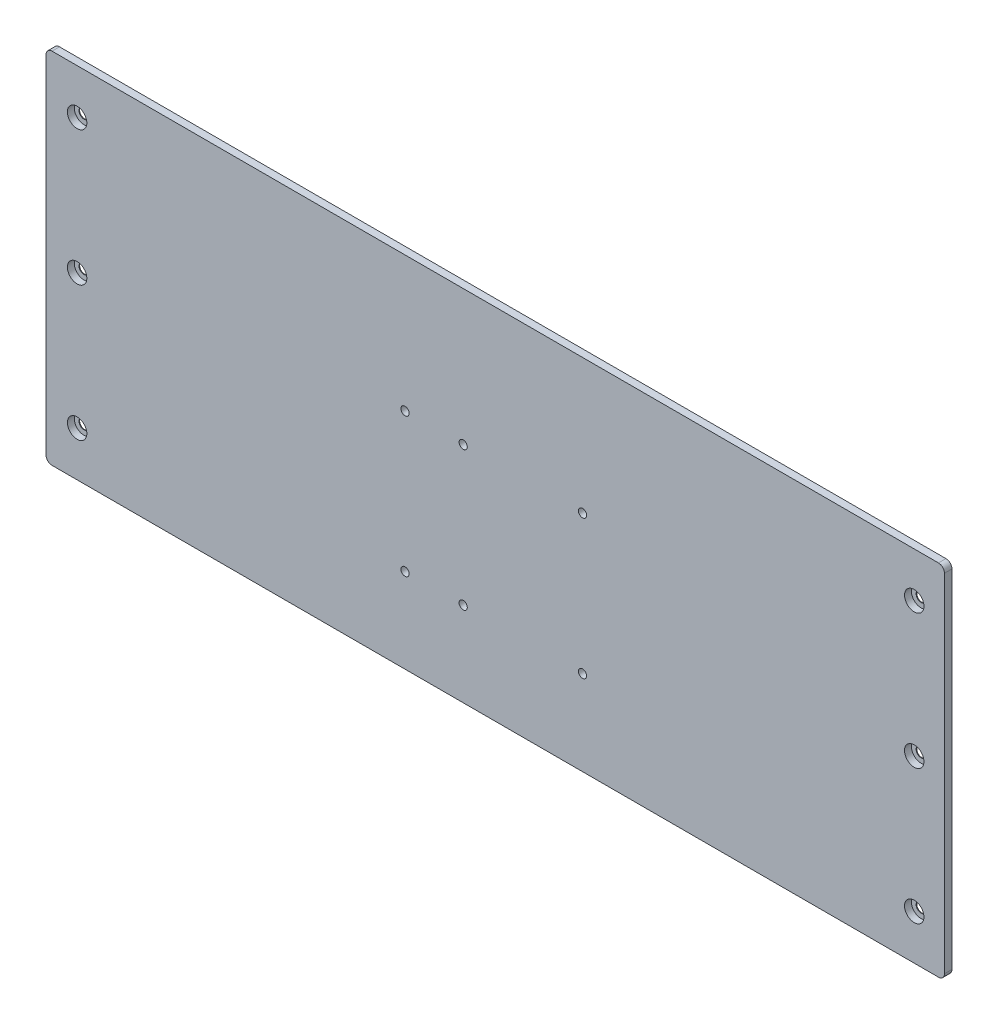
ISO-10303-21;
HEADER;
FILE_DESCRIPTION(('STEP AP214'),'2;1');
FILE_NAME('part.step','',(''),(''),'','','');
FILE_SCHEMA(('AUTOMOTIVE_DESIGN { 1 0 10303 214 1 1 1 1 }'));
ENDSEC;
DATA;
#1=APPLICATION_CONTEXT('core data for automotive mechanical design processes');
#2=APPLICATION_PROTOCOL_DEFINITION('international standard','automotive_design',2000,#1);
#3=PRODUCT_CONTEXT('',#1,'mechanical');
#4=PRODUCT('Part','Part','',(#3));
#5=PRODUCT_RELATED_PRODUCT_CATEGORY('part','',(#4));
#6=PRODUCT_DEFINITION_FORMATION('','',#4);
#7=PRODUCT_DEFINITION_CONTEXT('part definition',#1,'design');
#8=PRODUCT_DEFINITION('design','',#6,#7);
#9=PRODUCT_DEFINITION_SHAPE('','',#8);
#10=(LENGTH_UNIT() NAMED_UNIT(*) SI_UNIT(.MILLI.,.METRE.));
#11=(NAMED_UNIT(*) PLANE_ANGLE_UNIT() SI_UNIT($,.RADIAN.));
#12=(NAMED_UNIT(*) SI_UNIT($,.STERADIAN.) SOLID_ANGLE_UNIT());
#13=UNCERTAINTY_MEASURE_WITH_UNIT(LENGTH_MEASURE(1.E-05),#10,'distance_accuracy_value','');
#14=(GEOMETRIC_REPRESENTATION_CONTEXT(3) GLOBAL_UNCERTAINTY_ASSIGNED_CONTEXT((#13)) GLOBAL_UNIT_ASSIGNED_CONTEXT((#10,
#11,#12)) REPRESENTATION_CONTEXT('',''));
#15=CARTESIAN_POINT('',(0.,0.,0.));
#16=DIRECTION('',(0.,0.,1.));
#17=DIRECTION('',(1.,0.,0.));
#18=AXIS2_PLACEMENT_3D('',#15,#16,#17);
#19=CARTESIAN_POINT('',(-296.5,-116.,5.));
#20=DIRECTION('',(0.,0.,-1.));
#21=DIRECTION('',(-1.,0.,0.));
#22=AXIS2_PLACEMENT_3D('',#19,#20,#21);
#23=CYLINDRICAL_SURFACE('',#22,4.);
#24=CARTESIAN_POINT('',(-296.5,-116.,0.));
#25=DIRECTION('',(0.,0.,1.));
#26=DIRECTION('',(-1.,0.,0.));
#27=AXIS2_PLACEMENT_3D('',#24,#25,#26);
#28=CIRCLE('',#27,4.);
#29=CARTESIAN_POINT('',(-300.5,-116.,0.));
#30=VERTEX_POINT('',#29);
#31=CARTESIAN_POINT('',(-296.5,-120.,0.));
#32=VERTEX_POINT('',#31);
#33=EDGE_CURVE('E129',#30,#32,#28,.T.);
#34=ORIENTED_EDGE('',*,*,#33,.T.);
#35=DIRECTION('',(0.,0.,-1.));
#36=VECTOR('',#35,1.);
#37=CARTESIAN_POINT('',(-296.5,-120.,5.));
#38=LINE('',#37,#36);
#39=CARTESIAN_POINT('',(-296.5,-120.,5.));
#40=VERTEX_POINT('',#39);
#41=EDGE_CURVE('E11',#40,#32,#38,.T.);
#42=ORIENTED_EDGE('',*,*,#41,.F.);
#43=CARTESIAN_POINT('',(-296.5,-116.,5.));
#44=DIRECTION('',(0.,0.,1.));
#45=DIRECTION('',(-1.,0.,0.));
#46=AXIS2_PLACEMENT_3D('',#43,#44,#45);
#47=CIRCLE('',#46,4.);
#48=CARTESIAN_POINT('',(-300.5,-116.,5.));
#49=VERTEX_POINT('',#48);
#50=EDGE_CURVE('E144',#49,#40,#47,.T.);
#51=ORIENTED_EDGE('',*,*,#50,.F.);
#52=DIRECTION('',(0.,0.,-1.));
#53=VECTOR('',#52,1.);
#54=CARTESIAN_POINT('',(-300.5,-116.,5.));
#55=LINE('',#54,#53);
#56=EDGE_CURVE('E125',#49,#30,#55,.T.);
#57=ORIENTED_EDGE('',*,*,#56,.T.);
#58=EDGE_LOOP('',(#34,#42,#51,#57));
#59=FACE_BOUND('',#58,.T.);
#60=ADVANCED_FACE('F33',(#59),#23,.T.);
#61=CARTESIAN_POINT('',(-296.5,-120.,5.));
#62=DIRECTION('',(0.,1.,0.));
#63=DIRECTION('',(0.,0.,1.));
#64=AXIS2_PLACEMENT_3D('',#61,#62,#63);
#65=PLANE('',#64);
#66=DIRECTION('',(1.,0.,0.));
#67=VECTOR('',#66,1.);
#68=CARTESIAN_POINT('',(-296.5,-120.,0.));
#69=LINE('',#68,#67);
#70=CARTESIAN_POINT('',(296.5,-120.,0.));
#71=VERTEX_POINT('',#70);
#72=EDGE_CURVE('E132',#32,#71,#69,.T.);
#73=ORIENTED_EDGE('',*,*,#72,.T.);
#74=DIRECTION('',(0.,0.,-1.));
#75=VECTOR('',#74,1.);
#76=CARTESIAN_POINT('',(296.5,-120.,5.));
#77=LINE('',#76,#75);
#78=CARTESIAN_POINT('',(296.5,-120.,5.));
#79=VERTEX_POINT('',#78);
#80=EDGE_CURVE('E41',#79,#71,#77,.T.);
#81=ORIENTED_EDGE('',*,*,#80,.F.);
#82=DIRECTION('',(1.,0.,0.));
#83=VECTOR('',#82,1.);
#84=CARTESIAN_POINT('',(-296.5,-120.,5.));
#85=LINE('',#84,#83);
#86=EDGE_CURVE('E92',#40,#79,#85,.T.);
#87=ORIENTED_EDGE('',*,*,#86,.F.);
#88=ORIENTED_EDGE('',*,*,#41,.T.);
#89=EDGE_LOOP('',(#73,#81,#87,#88));
#90=FACE_BOUND('',#89,.T.);
#91=ADVANCED_FACE('F356',(#90),#65,.F.);
#92=CARTESIAN_POINT('',(296.5,-116.,5.));
#93=DIRECTION('',(0.,0.,-1.));
#94=DIRECTION('',(-1.,0.,0.));
#95=AXIS2_PLACEMENT_3D('',#92,#93,#94);
#96=CYLINDRICAL_SURFACE('',#95,4.);
#97=CARTESIAN_POINT('',(296.5,-116.,0.));
#98=DIRECTION('',(0.,0.,1.));
#99=DIRECTION('',(1.,0.,0.));
#100=AXIS2_PLACEMENT_3D('',#97,#98,#99);
#101=CIRCLE('',#100,4.);
#102=CARTESIAN_POINT('',(300.5,-116.,0.));
#103=VERTEX_POINT('',#102);
#104=EDGE_CURVE('E135',#71,#103,#101,.T.);
#105=ORIENTED_EDGE('',*,*,#104,.T.);
#106=DIRECTION('',(0.,0.,-1.));
#107=VECTOR('',#106,1.);
#108=CARTESIAN_POINT('',(300.5,-116.,5.));
#109=LINE('',#108,#107);
#110=CARTESIAN_POINT('',(300.5,-116.,5.));
#111=VERTEX_POINT('',#110);
#112=EDGE_CURVE('E151',#111,#103,#109,.T.);
#113=ORIENTED_EDGE('',*,*,#112,.F.);
#114=CARTESIAN_POINT('',(296.5,-116.,5.));
#115=DIRECTION('',(0.,0.,1.));
#116=DIRECTION('',(1.,0.,0.));
#117=AXIS2_PLACEMENT_3D('',#114,#115,#116);
#118=CIRCLE('',#117,4.);
#119=EDGE_CURVE('E159',#79,#111,#118,.T.);
#120=ORIENTED_EDGE('',*,*,#119,.F.);
#121=ORIENTED_EDGE('',*,*,#80,.T.);
#122=EDGE_LOOP('',(#105,#113,#120,#121));
#123=FACE_BOUND('',#122,.T.);
#124=ADVANCED_FACE('F157',(#123),#96,.T.);
#125=CARTESIAN_POINT('',(300.5,-116.,5.));
#126=DIRECTION('',(-1.,0.,0.));
#127=DIRECTION('',(0.,0.,1.));
#128=AXIS2_PLACEMENT_3D('',#125,#126,#127);
#129=PLANE('',#128);
#130=DIRECTION('',(0.,1.,0.));
#131=VECTOR('',#130,1.);
#132=CARTESIAN_POINT('',(300.5,-116.,0.));
#133=LINE('',#132,#131);
#134=CARTESIAN_POINT('',(300.5,116.,0.));
#135=VERTEX_POINT('',#134);
#136=EDGE_CURVE('E137',#103,#135,#133,.T.);
#137=ORIENTED_EDGE('',*,*,#136,.T.);
#138=DIRECTION('',(0.,0.,-1.));
#139=VECTOR('',#138,1.);
#140=CARTESIAN_POINT('',(300.5,116.,5.));
#141=LINE('',#140,#139);
#142=CARTESIAN_POINT('',(300.5,116.,5.));
#143=VERTEX_POINT('',#142);
#144=EDGE_CURVE('E148',#143,#135,#141,.T.);
#145=ORIENTED_EDGE('',*,*,#144,.F.);
#146=DIRECTION('',(0.,1.,0.));
#147=VECTOR('',#146,1.);
#148=CARTESIAN_POINT('',(300.5,-116.,5.));
#149=LINE('',#148,#147);
#150=EDGE_CURVE('E171',#111,#143,#149,.T.);
#151=ORIENTED_EDGE('',*,*,#150,.F.);
#152=ORIENTED_EDGE('',*,*,#112,.T.);
#153=EDGE_LOOP('',(#137,#145,#151,#152));
#154=FACE_BOUND('',#153,.T.);
#155=ADVANCED_FACE('F167',(#154),#129,.F.);
#156=CARTESIAN_POINT('',(296.5,116.,5.));
#157=DIRECTION('',(0.,0.,-1.));
#158=DIRECTION('',(-1.,0.,0.));
#159=AXIS2_PLACEMENT_3D('',#156,#157,#158);
#160=CYLINDRICAL_SURFACE('',#159,4.);
#161=CARTESIAN_POINT('',(296.5,116.,0.));
#162=DIRECTION('',(0.,0.,1.));
#163=DIRECTION('',(1.,0.,0.));
#164=AXIS2_PLACEMENT_3D('',#161,#162,#163);
#165=CIRCLE('',#164,4.);
#166=CARTESIAN_POINT('',(296.5,120.,0.));
#167=VERTEX_POINT('',#166);
#168=EDGE_CURVE('E139',#135,#167,#165,.T.);
#169=ORIENTED_EDGE('',*,*,#168,.T.);
#170=DIRECTION('',(0.,0.,-1.));
#171=VECTOR('',#170,1.);
#172=CARTESIAN_POINT('',(296.5,120.,5.));
#173=LINE('',#172,#171);
#174=CARTESIAN_POINT('',(296.5,120.,5.));
#175=VERTEX_POINT('',#174);
#176=EDGE_CURVE('E120',#175,#167,#173,.T.);
#177=ORIENTED_EDGE('',*,*,#176,.F.);
#178=CARTESIAN_POINT('',(296.5,116.,5.));
#179=DIRECTION('',(0.,0.,1.));
#180=DIRECTION('',(1.,0.,0.));
#181=AXIS2_PLACEMENT_3D('',#178,#179,#180);
#182=CIRCLE('',#181,4.);
#183=EDGE_CURVE('E111',#143,#175,#182,.T.);
#184=ORIENTED_EDGE('',*,*,#183,.F.);
#185=ORIENTED_EDGE('',*,*,#144,.T.);
#186=EDGE_LOOP('',(#169,#177,#184,#185));
#187=FACE_BOUND('',#186,.T.);
#188=ADVANCED_FACE('F170',(#187),#160,.T.);
#189=CARTESIAN_POINT('',(-296.5,120.,5.));
#190=DIRECTION('',(0.,-1.,0.));
#191=DIRECTION('',(0.,0.,-1.));
#192=AXIS2_PLACEMENT_3D('',#189,#190,#191);
#193=PLANE('',#192);
#194=DIRECTION('',(-1.,0.,0.));
#195=VECTOR('',#194,1.);
#196=CARTESIAN_POINT('',(-296.5,120.,0.));
#197=LINE('',#196,#195);
#198=CARTESIAN_POINT('',(-296.5,120.,0.));
#199=VERTEX_POINT('',#198);
#200=EDGE_CURVE('E119',#167,#199,#197,.T.);
#201=ORIENTED_EDGE('',*,*,#200,.T.);
#202=DIRECTION('',(0.,0.,-1.));
#203=VECTOR('',#202,1.);
#204=CARTESIAN_POINT('',(-296.5,120.,5.));
#205=LINE('',#204,#203);
#206=CARTESIAN_POINT('',(-296.5,120.,5.));
#207=VERTEX_POINT('',#206);
#208=EDGE_CURVE('E116',#207,#199,#205,.T.);
#209=ORIENTED_EDGE('',*,*,#208,.F.);
#210=DIRECTION('',(-1.,0.,0.));
#211=VECTOR('',#210,1.);
#212=CARTESIAN_POINT('',(-296.5,120.,5.));
#213=LINE('',#212,#211);
#214=EDGE_CURVE('E105',#175,#207,#213,.T.);
#215=ORIENTED_EDGE('',*,*,#214,.F.);
#216=ORIENTED_EDGE('',*,*,#176,.T.);
#217=EDGE_LOOP('',(#201,#209,#215,#216));
#218=FACE_BOUND('',#217,.T.);
#219=ADVANCED_FACE('F117',(#218),#193,.F.);
#220=CARTESIAN_POINT('',(-296.5,116.,5.));
#221=DIRECTION('',(0.,0.,-1.));
#222=DIRECTION('',(-1.,0.,0.));
#223=AXIS2_PLACEMENT_3D('',#220,#221,#222);
#224=CYLINDRICAL_SURFACE('',#223,4.);
#225=CARTESIAN_POINT('',(-296.5,116.,0.));
#226=DIRECTION('',(0.,0.,1.));
#227=DIRECTION('',(-1.,0.,0.));
#228=AXIS2_PLACEMENT_3D('',#225,#226,#227);
#229=CIRCLE('',#228,4.);
#230=CARTESIAN_POINT('',(-300.5,116.,0.));
#231=VERTEX_POINT('',#230);
#232=EDGE_CURVE('E78',#199,#231,#229,.T.);
#233=ORIENTED_EDGE('',*,*,#232,.T.);
#234=DIRECTION('',(0.,0.,-1.));
#235=VECTOR('',#234,1.);
#236=CARTESIAN_POINT('',(-300.5,116.,5.));
#237=LINE('',#236,#235);
#238=CARTESIAN_POINT('',(-300.5,116.,5.));
#239=VERTEX_POINT('',#238);
#240=EDGE_CURVE('E121',#239,#231,#237,.T.);
#241=ORIENTED_EDGE('',*,*,#240,.F.);
#242=CARTESIAN_POINT('',(-296.5,116.,5.));
#243=DIRECTION('',(0.,0.,1.));
#244=DIRECTION('',(-1.,0.,0.));
#245=AXIS2_PLACEMENT_3D('',#242,#243,#244);
#246=CIRCLE('',#245,4.);
#247=EDGE_CURVE('E109',#207,#239,#246,.T.);
#248=ORIENTED_EDGE('',*,*,#247,.F.);
#249=ORIENTED_EDGE('',*,*,#208,.T.);
#250=EDGE_LOOP('',(#233,#241,#248,#249));
#251=FACE_BOUND('',#250,.T.);
#252=ADVANCED_FACE('F123',(#251),#224,.T.);
#253=CARTESIAN_POINT('',(-300.5,-116.,5.));
#254=DIRECTION('',(1.,0.,0.));
#255=DIRECTION('',(0.,0.,-1.));
#256=AXIS2_PLACEMENT_3D('',#253,#254,#255);
#257=PLANE('',#256);
#258=DIRECTION('',(0.,-1.,0.));
#259=VECTOR('',#258,1.);
#260=CARTESIAN_POINT('',(-300.5,-116.,0.));
#261=LINE('',#260,#259);
#262=EDGE_CURVE('E84',#231,#30,#261,.T.);
#263=ORIENTED_EDGE('',*,*,#262,.T.);
#264=ORIENTED_EDGE('',*,*,#56,.F.);
#265=DIRECTION('',(0.,-1.,0.));
#266=VECTOR('',#265,1.);
#267=CARTESIAN_POINT('',(-300.5,-116.,5.));
#268=LINE('',#267,#266);
#269=EDGE_CURVE('E49',#239,#49,#268,.T.);
#270=ORIENTED_EDGE('',*,*,#269,.F.);
#271=ORIENTED_EDGE('',*,*,#240,.T.);
#272=EDGE_LOOP('',(#263,#264,#270,#271));
#273=FACE_BOUND('',#272,.T.);
#274=ADVANCED_FACE('F314',(#273),#257,.F.);
#275=CARTESIAN_POINT('',(-296.5,-116.,5.));
#276=DIRECTION('',(0.,0.,-1.));
#277=DIRECTION('',(-1.,0.,0.));
#278=AXIS2_PLACEMENT_3D('',#275,#276,#277);
#279=PLANE('',#278);
#280=CARTESIAN_POINT('',(-21.4679540056422,29.5803096634037,5.));
#281=DIRECTION('',(0.,0.,1.));
#282=DIRECTION('',(1.,0.,0.));
#283=AXIS2_PLACEMENT_3D('',#280,#281,#282);
#284=CIRCLE('',#283,2.75);
#285=CARTESIAN_POINT('',(-18.7179540056422,29.5803096634037,5.));
#286=VERTEX_POINT('',#285);
#287=EDGE_CURVE('E296',#286,#286,#284,.T.);
#288=ORIENTED_EDGE('',*,*,#287,.F.);
#289=EDGE_LOOP('',(#288));
#290=FACE_BOUND('',#289,.T.);
#291=CARTESIAN_POINT('',(58.3681719088992,29.8249942828152,5.));
#292=DIRECTION('',(0.,0.,1.));
#293=DIRECTION('',(1.,0.,0.));
#294=AXIS2_PLACEMENT_3D('',#291,#292,#293);
#295=CIRCLE('',#294,2.75);
#296=CARTESIAN_POINT('',(61.1181719088992,29.8249942828152,5.));
#297=VERTEX_POINT('',#296);
#298=EDGE_CURVE('E290',#297,#297,#295,.T.);
#299=ORIENTED_EDGE('',*,*,#298,.F.);
#300=EDGE_LOOP('',(#299));
#301=FACE_BOUND('',#300,.T.);
#302=CARTESIAN_POINT('',(-60.3750107724614,29.5803096634037,5.));
#303=DIRECTION('',(0.,0.,1.));
#304=DIRECTION('',(1.,0.,0.));
#305=AXIS2_PLACEMENT_3D('',#302,#303,#304);
#306=CIRCLE('',#305,2.75);
#307=CARTESIAN_POINT('',(-57.6250107724614,29.5803096634037,5.));
#308=VERTEX_POINT('',#307);
#309=EDGE_CURVE('E284',#308,#308,#306,.T.);
#310=ORIENTED_EDGE('',*,*,#309,.F.);
#311=EDGE_LOOP('',(#310));
#312=FACE_BOUND('',#311,.T.);
#313=CARTESIAN_POINT('',(-60.3750107724614,-63.4196903365963,5.));
#314=DIRECTION('',(0.,0.,1.));
#315=DIRECTION('',(1.,0.,0.));
#316=AXIS2_PLACEMENT_3D('',#313,#314,#315);
#317=CIRCLE('',#316,2.75);
#318=CARTESIAN_POINT('',(-57.6250107724614,-63.4196903365963,5.));
#319=VERTEX_POINT('',#318);
#320=EDGE_CURVE('E281',#319,#319,#317,.T.);
#321=ORIENTED_EDGE('',*,*,#320,.F.);
#322=EDGE_LOOP('',(#321));
#323=FACE_BOUND('',#322,.T.);
#324=CARTESIAN_POINT('',(-21.4679540056422,-63.4196903365963,5.));
#325=DIRECTION('',(0.,0.,1.));
#326=DIRECTION('',(1.,0.,0.));
#327=AXIS2_PLACEMENT_3D('',#324,#325,#326);
#328=CIRCLE('',#327,2.75);
#329=CARTESIAN_POINT('',(-18.7179540056422,-63.4196903365963,5.));
#330=VERTEX_POINT('',#329);
#331=EDGE_CURVE('E275',#330,#330,#328,.T.);
#332=ORIENTED_EDGE('',*,*,#331,.F.);
#333=EDGE_LOOP('',(#332));
#334=FACE_BOUND('',#333,.T.);
#335=CARTESIAN_POINT('',(58.3681719088992,-63.1750057171848,5.));
#336=DIRECTION('',(0.,0.,1.));
#337=DIRECTION('',(1.,0.,0.));
#338=AXIS2_PLACEMENT_3D('',#335,#336,#337);
#339=CIRCLE('',#338,2.75);
#340=CARTESIAN_POINT('',(61.1181719088992,-63.1750057171848,5.));
#341=VERTEX_POINT('',#340);
#342=EDGE_CURVE('E269',#341,#341,#339,.T.);
#343=ORIENTED_EDGE('',*,*,#342,.F.);
#344=EDGE_LOOP('',(#343));
#345=FACE_BOUND('',#344,.T.);
#346=CARTESIAN_POINT('',(-279.726805625543,90.,5.));
#347=DIRECTION('',(0.,0.,1.));
#348=DIRECTION('',(1.,0.,0.));
#349=AXIS2_PLACEMENT_3D('',#346,#347,#348);
#350=CIRCLE('',#349,6.50000000000001);
#351=CARTESIAN_POINT('',(-273.226805625543,90.,5.));
#352=VERTEX_POINT('',#351);
#353=EDGE_CURVE('E263',#352,#352,#350,.T.);
#354=ORIENTED_EDGE('',*,*,#353,.F.);
#355=EDGE_LOOP('',(#354));
#356=FACE_BOUND('',#355,.T.);
#357=CARTESIAN_POINT('',(-279.726805625543,-90.,5.));
#358=DIRECTION('',(0.,0.,1.));
#359=DIRECTION('',(1.,0.,0.));
#360=AXIS2_PLACEMENT_3D('',#357,#358,#359);
#361=CIRCLE('',#360,6.50000000000001);
#362=CARTESIAN_POINT('',(-273.226805625543,-90.,5.));
#363=VERTEX_POINT('',#362);
#364=EDGE_CURVE('E248',#363,#363,#361,.T.);
#365=ORIENTED_EDGE('',*,*,#364,.F.);
#366=EDGE_LOOP('',(#365));
#367=FACE_BOUND('',#366,.T.);
#368=CARTESIAN_POINT('',(-279.726805625543,0.,5.));
#369=DIRECTION('',(0.,0.,1.));
#370=DIRECTION('',(1.,0.,0.));
#371=AXIS2_PLACEMENT_3D('',#368,#369,#370);
#372=CIRCLE('',#371,6.50000000000001);
#373=CARTESIAN_POINT('',(-273.226805625543,0.,5.));
#374=VERTEX_POINT('',#373);
#375=EDGE_CURVE('E233',#374,#374,#372,.T.);
#376=ORIENTED_EDGE('',*,*,#375,.F.);
#377=EDGE_LOOP('',(#376));
#378=FACE_BOUND('',#377,.T.);
#379=CARTESIAN_POINT('',(280.273194374457,0.,5.));
#380=DIRECTION('',(0.,0.,1.));
#381=DIRECTION('',(1.,0.,0.));
#382=AXIS2_PLACEMENT_3D('',#379,#380,#381);
#383=CIRCLE('',#382,6.50000000000001);
#384=CARTESIAN_POINT('',(286.773194374457,0.,5.));
#385=VERTEX_POINT('',#384);
#386=EDGE_CURVE('E218',#385,#385,#383,.T.);
#387=ORIENTED_EDGE('',*,*,#386,.F.);
#388=EDGE_LOOP('',(#387));
#389=FACE_BOUND('',#388,.T.);
#390=CARTESIAN_POINT('',(280.273194374457,90.,5.));
#391=DIRECTION('',(0.,0.,1.));
#392=DIRECTION('',(1.,0.,0.));
#393=AXIS2_PLACEMENT_3D('',#390,#391,#392);
#394=CIRCLE('',#393,6.50000000000001);
#395=CARTESIAN_POINT('',(286.773194374457,90.,5.));
#396=VERTEX_POINT('',#395);
#397=EDGE_CURVE('E203',#396,#396,#394,.T.);
#398=ORIENTED_EDGE('',*,*,#397,.F.);
#399=EDGE_LOOP('',(#398));
#400=FACE_BOUND('',#399,.T.);
#401=CARTESIAN_POINT('',(280.273194374457,-90.,5.));
#402=DIRECTION('',(0.,0.,1.));
#403=DIRECTION('',(1.,0.,0.));
#404=AXIS2_PLACEMENT_3D('',#401,#402,#403);
#405=CIRCLE('',#404,6.50000000000001);
#406=CARTESIAN_POINT('',(286.773194374457,-90.,5.));
#407=VERTEX_POINT('',#406);
#408=EDGE_CURVE('E188',#407,#407,#405,.T.);
#409=ORIENTED_EDGE('',*,*,#408,.F.);
#410=EDGE_LOOP('',(#409));
#411=FACE_BOUND('',#410,.T.);
#412=ORIENTED_EDGE('',*,*,#50,.T.);
#413=ORIENTED_EDGE('',*,*,#86,.T.);
#414=ORIENTED_EDGE('',*,*,#119,.T.);
#415=ORIENTED_EDGE('',*,*,#150,.T.);
#416=ORIENTED_EDGE('',*,*,#183,.T.);
#417=ORIENTED_EDGE('',*,*,#214,.T.);
#418=ORIENTED_EDGE('',*,*,#247,.T.);
#419=ORIENTED_EDGE('',*,*,#269,.T.);
#420=EDGE_LOOP('',(#412,#413,#414,#415,#416,#417,#418,#419));
#421=FACE_BOUND('',#420,.T.);
#422=ADVANCED_FACE('F107',(#290,#301,#312,#323,#334,#345,#356,#367,#378,#389,#400,#411,#421),
#279,.F.);
#423=CARTESIAN_POINT('',(-296.5,-116.,0.));
#424=DIRECTION('',(0.,0.,-1.));
#425=DIRECTION('',(-1.,0.,0.));
#426=AXIS2_PLACEMENT_3D('',#423,#424,#425);
#427=PLANE('',#426);
#428=CARTESIAN_POINT('',(-21.4679540056422,29.5803096634037,0.));
#429=DIRECTION('',(0.,0.,1.));
#430=DIRECTION('',(1.,0.,0.));
#431=AXIS2_PLACEMENT_3D('',#428,#429,#430);
#432=CIRCLE('',#431,2.75);
#433=CARTESIAN_POINT('',(-18.7179540056422,29.5803096634037,0.));
#434=VERTEX_POINT('',#433);
#435=EDGE_CURVE('E299',#434,#434,#432,.T.);
#436=ORIENTED_EDGE('',*,*,#435,.T.);
#437=EDGE_LOOP('',(#436));
#438=FACE_BOUND('',#437,.T.);
#439=CARTESIAN_POINT('',(58.3681719088992,29.8249942828152,0.));
#440=DIRECTION('',(0.,0.,1.));
#441=DIRECTION('',(1.,0.,0.));
#442=AXIS2_PLACEMENT_3D('',#439,#440,#441);
#443=CIRCLE('',#442,2.75);
#444=CARTESIAN_POINT('',(61.1181719088992,29.8249942828152,0.));
#445=VERTEX_POINT('',#444);
#446=EDGE_CURVE('E293',#445,#445,#443,.T.);
#447=ORIENTED_EDGE('',*,*,#446,.T.);
#448=EDGE_LOOP('',(#447));
#449=FACE_BOUND('',#448,.T.);
#450=CARTESIAN_POINT('',(-60.3750107724614,29.5803096634037,0.));
#451=DIRECTION('',(0.,0.,1.));
#452=DIRECTION('',(1.,0.,0.));
#453=AXIS2_PLACEMENT_3D('',#450,#451,#452);
#454=CIRCLE('',#453,2.75);
#455=CARTESIAN_POINT('',(-57.6250107724614,29.5803096634037,0.));
#456=VERTEX_POINT('',#455);
#457=EDGE_CURVE('E287',#456,#456,#454,.T.);
#458=ORIENTED_EDGE('',*,*,#457,.T.);
#459=EDGE_LOOP('',(#458));
#460=FACE_BOUND('',#459,.T.);
#461=CARTESIAN_POINT('',(-60.3750107724614,-63.4196903365963,0.));
#462=DIRECTION('',(0.,0.,1.));
#463=DIRECTION('',(1.,0.,0.));
#464=AXIS2_PLACEMENT_3D('',#461,#462,#463);
#465=CIRCLE('',#464,2.75);
#466=CARTESIAN_POINT('',(-57.6250107724614,-63.4196903365963,0.));
#467=VERTEX_POINT('',#466);
#468=EDGE_CURVE('E278',#467,#467,#465,.T.);
#469=ORIENTED_EDGE('',*,*,#468,.T.);
#470=EDGE_LOOP('',(#469));
#471=FACE_BOUND('',#470,.T.);
#472=CARTESIAN_POINT('',(-21.4679540056422,-63.4196903365963,0.));
#473=DIRECTION('',(0.,0.,1.));
#474=DIRECTION('',(1.,0.,0.));
#475=AXIS2_PLACEMENT_3D('',#472,#473,#474);
#476=CIRCLE('',#475,2.75);
#477=CARTESIAN_POINT('',(-18.7179540056422,-63.4196903365963,0.));
#478=VERTEX_POINT('',#477);
#479=EDGE_CURVE('E272',#478,#478,#476,.T.);
#480=ORIENTED_EDGE('',*,*,#479,.T.);
#481=EDGE_LOOP('',(#480));
#482=FACE_BOUND('',#481,.T.);
#483=CARTESIAN_POINT('',(58.3681719088992,-63.1750057171848,0.));
#484=DIRECTION('',(0.,0.,1.));
#485=DIRECTION('',(1.,0.,0.));
#486=AXIS2_PLACEMENT_3D('',#483,#484,#485);
#487=CIRCLE('',#486,2.75);
#488=CARTESIAN_POINT('',(61.1181719088992,-63.1750057171848,0.));
#489=VERTEX_POINT('',#488);
#490=EDGE_CURVE('E266',#489,#489,#487,.T.);
#491=ORIENTED_EDGE('',*,*,#490,.T.);
#492=EDGE_LOOP('',(#491));
#493=FACE_BOUND('',#492,.T.);
#494=CARTESIAN_POINT('',(-279.726805625543,90.,0.));
#495=DIRECTION('',(0.,0.,1.));
#496=DIRECTION('',(1.,0.,0.));
#497=AXIS2_PLACEMENT_3D('',#494,#495,#496);
#498=CIRCLE('',#497,3.30000000000003);
#499=CARTESIAN_POINT('',(-276.426805625543,90.,0.));
#500=VERTEX_POINT('',#499);
#501=EDGE_CURVE('E260',#500,#500,#498,.T.);
#502=ORIENTED_EDGE('',*,*,#501,.T.);
#503=EDGE_LOOP('',(#502));
#504=FACE_BOUND('',#503,.T.);
#505=CARTESIAN_POINT('',(-279.726805625543,-90.,0.));
#506=DIRECTION('',(0.,0.,1.));
#507=DIRECTION('',(1.,0.,0.));
#508=AXIS2_PLACEMENT_3D('',#505,#506,#507);
#509=CIRCLE('',#508,3.30000000000003);
#510=CARTESIAN_POINT('',(-276.426805625543,-90.,0.));
#511=VERTEX_POINT('',#510);
#512=EDGE_CURVE('E245',#511,#511,#509,.T.);
#513=ORIENTED_EDGE('',*,*,#512,.T.);
#514=EDGE_LOOP('',(#513));
#515=FACE_BOUND('',#514,.T.);
#516=CARTESIAN_POINT('',(-279.726805625543,0.,0.));
#517=DIRECTION('',(0.,0.,1.));
#518=DIRECTION('',(1.,0.,0.));
#519=AXIS2_PLACEMENT_3D('',#516,#517,#518);
#520=CIRCLE('',#519,3.30000000000003);
#521=CARTESIAN_POINT('',(-276.426805625543,0.,0.));
#522=VERTEX_POINT('',#521);
#523=EDGE_CURVE('E230',#522,#522,#520,.T.);
#524=ORIENTED_EDGE('',*,*,#523,.T.);
#525=EDGE_LOOP('',(#524));
#526=FACE_BOUND('',#525,.T.);
#527=CARTESIAN_POINT('',(280.273194374457,0.,0.));
#528=DIRECTION('',(0.,0.,1.));
#529=DIRECTION('',(1.,0.,0.));
#530=AXIS2_PLACEMENT_3D('',#527,#528,#529);
#531=CIRCLE('',#530,3.30000000000003);
#532=CARTESIAN_POINT('',(283.573194374457,0.,0.));
#533=VERTEX_POINT('',#532);
#534=EDGE_CURVE('E206',#533,#533,#531,.T.);
#535=ORIENTED_EDGE('',*,*,#534,.T.);
#536=EDGE_LOOP('',(#535));
#537=FACE_BOUND('',#536,.T.);
#538=CARTESIAN_POINT('',(280.273194374457,90.,0.));
#539=DIRECTION('',(0.,0.,1.));
#540=DIRECTION('',(1.,0.,0.));
#541=AXIS2_PLACEMENT_3D('',#538,#539,#540);
#542=CIRCLE('',#541,3.30000000000003);
#543=CARTESIAN_POINT('',(283.573194374457,90.,0.));
#544=VERTEX_POINT('',#543);
#545=EDGE_CURVE('E191',#544,#544,#542,.T.);
#546=ORIENTED_EDGE('',*,*,#545,.T.);
#547=EDGE_LOOP('',(#546));
#548=FACE_BOUND('',#547,.T.);
#549=CARTESIAN_POINT('',(280.273194374457,-90.,0.));
#550=DIRECTION('',(0.,0.,1.));
#551=DIRECTION('',(1.,0.,0.));
#552=AXIS2_PLACEMENT_3D('',#549,#550,#551);
#553=CIRCLE('',#552,3.30000000000003);
#554=CARTESIAN_POINT('',(283.573194374457,-90.,0.));
#555=VERTEX_POINT('',#554);
#556=EDGE_CURVE('E133',#555,#555,#553,.T.);
#557=ORIENTED_EDGE('',*,*,#556,.T.);
#558=EDGE_LOOP('',(#557));
#559=FACE_BOUND('',#558,.T.);
#560=ORIENTED_EDGE('',*,*,#33,.F.);
#561=ORIENTED_EDGE('',*,*,#262,.F.);
#562=ORIENTED_EDGE('',*,*,#232,.F.);
#563=ORIENTED_EDGE('',*,*,#200,.F.);
#564=ORIENTED_EDGE('',*,*,#168,.F.);
#565=ORIENTED_EDGE('',*,*,#136,.F.);
#566=ORIENTED_EDGE('',*,*,#104,.F.);
#567=ORIENTED_EDGE('',*,*,#72,.F.);
#568=EDGE_LOOP('',(#560,#561,#562,#563,#564,#565,#566,#567));
#569=FACE_BOUND('',#568,.T.);
#570=ADVANCED_FACE('F163',(#438,#449,#460,#471,#482,#493,#504,#515,#526,#537,#548,#559,#569),
#427,.T.);
#571=CARTESIAN_POINT('',(280.273194374457,-90.,5.));
#572=DIRECTION('',(0.,0.,1.));
#573=DIRECTION('',(1.,0.,0.));
#574=AXIS2_PLACEMENT_3D('',#571,#572,#573);
#575=CYLINDRICAL_SURFACE('',#574,3.30000000000003);
#576=ORIENTED_EDGE('',*,*,#556,.F.);
#577=EDGE_LOOP('',(#576));
#578=FACE_BOUND('',#577,.T.);
#579=CARTESIAN_POINT('',(280.273194374457,-90.,0.374999999999989));
#580=DIRECTION('',(0.,0.,1.));
#581=DIRECTION('',(1.,0.,0.));
#582=AXIS2_PLACEMENT_3D('',#579,#580,#581);
#583=CIRCLE('',#582,3.30000000000003);
#584=CARTESIAN_POINT('',(283.573194374457,-90.,0.374999999999989));
#585=VERTEX_POINT('',#584);
#586=EDGE_CURVE('E179',#585,#585,#583,.T.);
#587=ORIENTED_EDGE('',*,*,#586,.T.);
#588=EDGE_LOOP('',(#587));
#589=FACE_BOUND('',#588,.T.);
#590=ADVANCED_FACE('F409',(#578,#589),#575,.F.);
#591=CARTESIAN_POINT('',(280.273194374457,-90.,0.400000000000001));
#592=DIRECTION('',(0.,0.,1.));
#593=DIRECTION('',(1.,0.,0.));
#594=AXIS2_PLACEMENT_3D('',#591,#592,#593);
#595=CONICAL_SURFACE('',#594,3.32500000000002,0.785398163397153);
#596=ORIENTED_EDGE('',*,*,#586,.F.);
#597=EDGE_LOOP('',(#596));
#598=FACE_BOUND('',#597,.T.);
#599=CARTESIAN_POINT('',(280.273194374457,-90.,0.400000000000001));
#600=DIRECTION('',(0.,0.,1.));
#601=DIRECTION('',(1.,0.,0.));
#602=AXIS2_PLACEMENT_3D('',#599,#600,#601);
#603=CIRCLE('',#602,3.32500000000002);
#604=CARTESIAN_POINT('',(283.598194374457,-90.,0.400000000000001));
#605=VERTEX_POINT('',#604);
#606=EDGE_CURVE('E182',#605,#605,#603,.T.);
#607=ORIENTED_EDGE('',*,*,#606,.T.);
#608=EDGE_LOOP('',(#607));
#609=FACE_BOUND('',#608,.T.);
#610=ADVANCED_FACE('F351',(#598,#609),#595,.F.);
#611=CARTESIAN_POINT('',(283.598194374457,-90.,0.400000000000002));
#612=DIRECTION('',(0.,0.,-1.));
#613=DIRECTION('',(-1.,0.,0.));
#614=AXIS2_PLACEMENT_3D('',#611,#612,#613);
#615=PLANE('',#614);
#616=ORIENTED_EDGE('',*,*,#606,.F.);
#617=EDGE_LOOP('',(#616));
#618=FACE_BOUND('',#617,.T.);
#619=CARTESIAN_POINT('',(280.273194374457,-90.,0.400000000000004));
#620=DIRECTION('',(0.,0.,1.));
#621=DIRECTION('',(1.,0.,0.));
#622=AXIS2_PLACEMENT_3D('',#619,#620,#621);
#623=CIRCLE('',#622,6.50000000000001);
#624=CARTESIAN_POINT('',(286.773194374457,-90.,0.400000000000004));
#625=VERTEX_POINT('',#624);
#626=EDGE_CURVE('E185',#625,#625,#623,.T.);
#627=ORIENTED_EDGE('',*,*,#626,.T.);
#628=EDGE_LOOP('',(#627));
#629=FACE_BOUND('',#628,.T.);
#630=ADVANCED_FACE('F341',(#618,#629),#615,.F.);
#631=CARTESIAN_POINT('',(280.273194374457,-90.,5.));
#632=DIRECTION('',(0.,0.,1.));
#633=DIRECTION('',(1.,0.,0.));
#634=AXIS2_PLACEMENT_3D('',#631,#632,#633);
#635=CYLINDRICAL_SURFACE('',#634,6.50000000000001);
#636=ORIENTED_EDGE('',*,*,#626,.F.);
#637=EDGE_LOOP('',(#636));
#638=FACE_BOUND('',#637,.T.);
#639=ORIENTED_EDGE('',*,*,#408,.T.);
#640=EDGE_LOOP('',(#639));
#641=FACE_BOUND('',#640,.T.);
#642=ADVANCED_FACE('F338',(#638,#641),#635,.F.);
#643=CARTESIAN_POINT('',(280.273194374457,90.,5.));
#644=DIRECTION('',(0.,0.,1.));
#645=DIRECTION('',(1.,0.,0.));
#646=AXIS2_PLACEMENT_3D('',#643,#644,#645);
#647=CYLINDRICAL_SURFACE('',#646,3.30000000000003);
#648=ORIENTED_EDGE('',*,*,#545,.F.);
#649=EDGE_LOOP('',(#648));
#650=FACE_BOUND('',#649,.T.);
#651=CARTESIAN_POINT('',(280.273194374457,90.,0.374999999999989));
#652=DIRECTION('',(0.,0.,1.));
#653=DIRECTION('',(1.,0.,0.));
#654=AXIS2_PLACEMENT_3D('',#651,#652,#653);
#655=CIRCLE('',#654,3.30000000000003);
#656=CARTESIAN_POINT('',(283.573194374457,90.,0.374999999999989));
#657=VERTEX_POINT('',#656);
#658=EDGE_CURVE('E194',#657,#657,#655,.T.);
#659=ORIENTED_EDGE('',*,*,#658,.T.);
#660=EDGE_LOOP('',(#659));
#661=FACE_BOUND('',#660,.T.);
#662=ADVANCED_FACE('F340',(#650,#661),#647,.F.);
#663=CARTESIAN_POINT('',(280.273194374457,90.,0.400000000000001));
#664=DIRECTION('',(0.,0.,1.));
#665=DIRECTION('',(1.,0.,0.));
#666=AXIS2_PLACEMENT_3D('',#663,#664,#665);
#667=CONICAL_SURFACE('',#666,3.32500000000002,0.785398163397153);
#668=ORIENTED_EDGE('',*,*,#658,.F.);
#669=EDGE_LOOP('',(#668));
#670=FACE_BOUND('',#669,.T.);
#671=CARTESIAN_POINT('',(280.273194374457,90.,0.400000000000001));
#672=DIRECTION('',(0.,0.,1.));
#673=DIRECTION('',(1.,0.,0.));
#674=AXIS2_PLACEMENT_3D('',#671,#672,#673);
#675=CIRCLE('',#674,3.32500000000002);
#676=CARTESIAN_POINT('',(283.598194374457,90.,0.400000000000001));
#677=VERTEX_POINT('',#676);
#678=EDGE_CURVE('E197',#677,#677,#675,.T.);
#679=ORIENTED_EDGE('',*,*,#678,.T.);
#680=EDGE_LOOP('',(#679));
#681=FACE_BOUND('',#680,.T.);
#682=ADVANCED_FACE('F348',(#670,#681),#667,.F.);
#683=CARTESIAN_POINT('',(283.598194374457,90.,0.400000000000002));
#684=DIRECTION('',(0.,0.,-1.));
#685=DIRECTION('',(-1.,0.,0.));
#686=AXIS2_PLACEMENT_3D('',#683,#684,#685);
#687=PLANE('',#686);
#688=ORIENTED_EDGE('',*,*,#678,.F.);
#689=EDGE_LOOP('',(#688));
#690=FACE_BOUND('',#689,.T.);
#691=CARTESIAN_POINT('',(280.273194374457,90.,0.400000000000004));
#692=DIRECTION('',(0.,0.,1.));
#693=DIRECTION('',(1.,0.,0.));
#694=AXIS2_PLACEMENT_3D('',#691,#692,#693);
#695=CIRCLE('',#694,6.50000000000001);
#696=CARTESIAN_POINT('',(286.773194374457,90.,0.400000000000004));
#697=VERTEX_POINT('',#696);
#698=EDGE_CURVE('E200',#697,#697,#695,.T.);
#699=ORIENTED_EDGE('',*,*,#698,.T.);
#700=EDGE_LOOP('',(#699));
#701=FACE_BOUND('',#700,.T.);
#702=ADVANCED_FACE('F450',(#690,#701),#687,.F.);
#703=CARTESIAN_POINT('',(280.273194374457,90.,5.));
#704=DIRECTION('',(0.,0.,1.));
#705=DIRECTION('',(1.,0.,0.));
#706=AXIS2_PLACEMENT_3D('',#703,#704,#705);
#707=CYLINDRICAL_SURFACE('',#706,6.50000000000001);
#708=ORIENTED_EDGE('',*,*,#698,.F.);
#709=EDGE_LOOP('',(#708));
#710=FACE_BOUND('',#709,.T.);
#711=ORIENTED_EDGE('',*,*,#397,.T.);
#712=EDGE_LOOP('',(#711));
#713=FACE_BOUND('',#712,.T.);
#714=ADVANCED_FACE('F460',(#710,#713),#707,.F.);
#715=CARTESIAN_POINT('',(280.273194374457,0.,5.));
#716=DIRECTION('',(0.,0.,1.));
#717=DIRECTION('',(1.,0.,0.));
#718=AXIS2_PLACEMENT_3D('',#715,#716,#717);
#719=CYLINDRICAL_SURFACE('',#718,3.30000000000003);
#720=ORIENTED_EDGE('',*,*,#534,.F.);
#721=EDGE_LOOP('',(#720));
#722=FACE_BOUND('',#721,.T.);
#723=CARTESIAN_POINT('',(280.273194374457,0.,0.374999999999989));
#724=DIRECTION('',(0.,0.,1.));
#725=DIRECTION('',(1.,0.,0.));
#726=AXIS2_PLACEMENT_3D('',#723,#724,#725);
#727=CIRCLE('',#726,3.30000000000003);
#728=CARTESIAN_POINT('',(283.573194374457,0.,0.374999999999989));
#729=VERTEX_POINT('',#728);
#730=EDGE_CURVE('E209',#729,#729,#727,.T.);
#731=ORIENTED_EDGE('',*,*,#730,.T.);
#732=EDGE_LOOP('',(#731));
#733=FACE_BOUND('',#732,.T.);
#734=ADVANCED_FACE('F470',(#722,#733),#719,.F.);
#735=CARTESIAN_POINT('',(280.273194374457,0.,0.400000000000001));
#736=DIRECTION('',(0.,0.,1.));
#737=DIRECTION('',(1.,0.,0.));
#738=AXIS2_PLACEMENT_3D('',#735,#736,#737);
#739=CONICAL_SURFACE('',#738,3.32500000000002,0.785398163397153);
#740=ORIENTED_EDGE('',*,*,#730,.F.);
#741=EDGE_LOOP('',(#740));
#742=FACE_BOUND('',#741,.T.);
#743=CARTESIAN_POINT('',(280.273194374457,0.,0.400000000000001));
#744=DIRECTION('',(0.,0.,1.));
#745=DIRECTION('',(1.,0.,0.));
#746=AXIS2_PLACEMENT_3D('',#743,#744,#745);
#747=CIRCLE('',#746,3.32500000000002);
#748=CARTESIAN_POINT('',(283.598194374457,0.,0.400000000000001));
#749=VERTEX_POINT('',#748);
#750=EDGE_CURVE('E212',#749,#749,#747,.T.);
#751=ORIENTED_EDGE('',*,*,#750,.T.);
#752=EDGE_LOOP('',(#751));
#753=FACE_BOUND('',#752,.T.);
#754=ADVANCED_FACE('F480',(#742,#753),#739,.F.);
#755=CARTESIAN_POINT('',(283.598194374457,0.,0.400000000000002));
#756=DIRECTION('',(0.,0.,-1.));
#757=DIRECTION('',(-1.,0.,0.));
#758=AXIS2_PLACEMENT_3D('',#755,#756,#757);
#759=PLANE('',#758);
#760=ORIENTED_EDGE('',*,*,#750,.F.);
#761=EDGE_LOOP('',(#760));
#762=FACE_BOUND('',#761,.T.);
#763=CARTESIAN_POINT('',(280.273194374457,0.,0.400000000000004));
#764=DIRECTION('',(0.,0.,1.));
#765=DIRECTION('',(1.,0.,0.));
#766=AXIS2_PLACEMENT_3D('',#763,#764,#765);
#767=CIRCLE('',#766,6.50000000000001);
#768=CARTESIAN_POINT('',(286.773194374457,0.,0.400000000000004));
#769=VERTEX_POINT('',#768);
#770=EDGE_CURVE('E215',#769,#769,#767,.T.);
#771=ORIENTED_EDGE('',*,*,#770,.T.);
#772=EDGE_LOOP('',(#771));
#773=FACE_BOUND('',#772,.T.);
#774=ADVANCED_FACE('F490',(#762,#773),#759,.F.);
#775=CARTESIAN_POINT('',(280.273194374457,0.,5.));
#776=DIRECTION('',(0.,0.,1.));
#777=DIRECTION('',(1.,0.,0.));
#778=AXIS2_PLACEMENT_3D('',#775,#776,#777);
#779=CYLINDRICAL_SURFACE('',#778,6.50000000000001);
#780=ORIENTED_EDGE('',*,*,#770,.F.);
#781=EDGE_LOOP('',(#780));
#782=FACE_BOUND('',#781,.T.);
#783=ORIENTED_EDGE('',*,*,#386,.T.);
#784=EDGE_LOOP('',(#783));
#785=FACE_BOUND('',#784,.T.);
#786=ADVANCED_FACE('F500',(#782,#785),#779,.F.);
#787=CARTESIAN_POINT('',(-279.726805625543,0.,5.));
#788=DIRECTION('',(0.,0.,1.));
#789=DIRECTION('',(1.,0.,0.));
#790=AXIS2_PLACEMENT_3D('',#787,#788,#789);
#791=CYLINDRICAL_SURFACE('',#790,3.30000000000003);
#792=ORIENTED_EDGE('',*,*,#523,.F.);
#793=EDGE_LOOP('',(#792));
#794=FACE_BOUND('',#793,.T.);
#795=CARTESIAN_POINT('',(-279.726805625543,0.,0.374999999999989));
#796=DIRECTION('',(0.,0.,1.));
#797=DIRECTION('',(1.,0.,0.));
#798=AXIS2_PLACEMENT_3D('',#795,#796,#797);
#799=CIRCLE('',#798,3.30000000000003);
#800=CARTESIAN_POINT('',(-276.426805625543,0.,0.374999999999989));
#801=VERTEX_POINT('',#800);
#802=EDGE_CURVE('E221',#801,#801,#799,.T.);
#803=ORIENTED_EDGE('',*,*,#802,.T.);
#804=EDGE_LOOP('',(#803));
#805=FACE_BOUND('',#804,.T.);
#806=ADVANCED_FACE('F510',(#794,#805),#791,.F.);
#807=CARTESIAN_POINT('',(-279.726805625543,0.,0.400000000000001));
#808=DIRECTION('',(0.,0.,1.));
#809=DIRECTION('',(1.,0.,0.));
#810=AXIS2_PLACEMENT_3D('',#807,#808,#809);
#811=CONICAL_SURFACE('',#810,3.32500000000002,0.785398163397153);
#812=ORIENTED_EDGE('',*,*,#802,.F.);
#813=EDGE_LOOP('',(#812));
#814=FACE_BOUND('',#813,.T.);
#815=CARTESIAN_POINT('',(-279.726805625543,0.,0.400000000000001));
#816=DIRECTION('',(0.,0.,1.));
#817=DIRECTION('',(1.,0.,0.));
#818=AXIS2_PLACEMENT_3D('',#815,#816,#817);
#819=CIRCLE('',#818,3.32500000000002);
#820=CARTESIAN_POINT('',(-276.401805625543,0.,0.400000000000001));
#821=VERTEX_POINT('',#820);
#822=EDGE_CURVE('E224',#821,#821,#819,.T.);
#823=ORIENTED_EDGE('',*,*,#822,.T.);
#824=EDGE_LOOP('',(#823));
#825=FACE_BOUND('',#824,.T.);
#826=ADVANCED_FACE('F520',(#814,#825),#811,.F.);
#827=CARTESIAN_POINT('',(-276.401805625543,0.,0.400000000000002));
#828=DIRECTION('',(0.,0.,-1.));
#829=DIRECTION('',(-1.,0.,0.));
#830=AXIS2_PLACEMENT_3D('',#827,#828,#829);
#831=PLANE('',#830);
#832=ORIENTED_EDGE('',*,*,#822,.F.);
#833=EDGE_LOOP('',(#832));
#834=FACE_BOUND('',#833,.T.);
#835=CARTESIAN_POINT('',(-279.726805625543,0.,0.400000000000004));
#836=DIRECTION('',(0.,0.,1.));
#837=DIRECTION('',(1.,0.,0.));
#838=AXIS2_PLACEMENT_3D('',#835,#836,#837);
#839=CIRCLE('',#838,6.50000000000001);
#840=CARTESIAN_POINT('',(-273.226805625543,0.,0.400000000000004));
#841=VERTEX_POINT('',#840);
#842=EDGE_CURVE('E227',#841,#841,#839,.T.);
#843=ORIENTED_EDGE('',*,*,#842,.T.);
#844=EDGE_LOOP('',(#843));
#845=FACE_BOUND('',#844,.T.);
#846=ADVANCED_FACE('F530',(#834,#845),#831,.F.);
#847=CARTESIAN_POINT('',(-279.726805625543,0.,5.));
#848=DIRECTION('',(0.,0.,1.));
#849=DIRECTION('',(1.,0.,0.));
#850=AXIS2_PLACEMENT_3D('',#847,#848,#849);
#851=CYLINDRICAL_SURFACE('',#850,6.50000000000001);
#852=ORIENTED_EDGE('',*,*,#842,.F.);
#853=EDGE_LOOP('',(#852));
#854=FACE_BOUND('',#853,.T.);
#855=ORIENTED_EDGE('',*,*,#375,.T.);
#856=EDGE_LOOP('',(#855));
#857=FACE_BOUND('',#856,.T.);
#858=ADVANCED_FACE('F540',(#854,#857),#851,.F.);
#859=CARTESIAN_POINT('',(-279.726805625543,-90.,5.));
#860=DIRECTION('',(0.,0.,1.));
#861=DIRECTION('',(1.,0.,0.));
#862=AXIS2_PLACEMENT_3D('',#859,#860,#861);
#863=CYLINDRICAL_SURFACE('',#862,3.30000000000003);
#864=ORIENTED_EDGE('',*,*,#512,.F.);
#865=EDGE_LOOP('',(#864));
#866=FACE_BOUND('',#865,.T.);
#867=CARTESIAN_POINT('',(-279.726805625543,-90.,0.374999999999989));
#868=DIRECTION('',(0.,0.,1.));
#869=DIRECTION('',(1.,0.,0.));
#870=AXIS2_PLACEMENT_3D('',#867,#868,#869);
#871=CIRCLE('',#870,3.30000000000003);
#872=CARTESIAN_POINT('',(-276.426805625543,-90.,0.374999999999989));
#873=VERTEX_POINT('',#872);
#874=EDGE_CURVE('E236',#873,#873,#871,.T.);
#875=ORIENTED_EDGE('',*,*,#874,.T.);
#876=EDGE_LOOP('',(#875));
#877=FACE_BOUND('',#876,.T.);
#878=ADVANCED_FACE('F550',(#866,#877),#863,.F.);
#879=CARTESIAN_POINT('',(-279.726805625543,-90.,0.400000000000001));
#880=DIRECTION('',(0.,0.,1.));
#881=DIRECTION('',(1.,0.,0.));
#882=AXIS2_PLACEMENT_3D('',#879,#880,#881);
#883=CONICAL_SURFACE('',#882,3.32500000000002,0.785398163397153);
#884=ORIENTED_EDGE('',*,*,#874,.F.);
#885=EDGE_LOOP('',(#884));
#886=FACE_BOUND('',#885,.T.);
#887=CARTESIAN_POINT('',(-279.726805625543,-90.,0.400000000000001));
#888=DIRECTION('',(0.,0.,1.));
#889=DIRECTION('',(1.,0.,0.));
#890=AXIS2_PLACEMENT_3D('',#887,#888,#889);
#891=CIRCLE('',#890,3.32500000000002);
#892=CARTESIAN_POINT('',(-276.401805625543,-90.,0.400000000000001));
#893=VERTEX_POINT('',#892);
#894=EDGE_CURVE('E239',#893,#893,#891,.T.);
#895=ORIENTED_EDGE('',*,*,#894,.T.);
#896=EDGE_LOOP('',(#895));
#897=FACE_BOUND('',#896,.T.);
#898=ADVANCED_FACE('F560',(#886,#897),#883,.F.);
#899=CARTESIAN_POINT('',(-276.401805625543,-90.,0.400000000000002));
#900=DIRECTION('',(0.,0.,-1.));
#901=DIRECTION('',(-1.,0.,0.));
#902=AXIS2_PLACEMENT_3D('',#899,#900,#901);
#903=PLANE('',#902);
#904=ORIENTED_EDGE('',*,*,#894,.F.);
#905=EDGE_LOOP('',(#904));
#906=FACE_BOUND('',#905,.T.);
#907=CARTESIAN_POINT('',(-279.726805625543,-90.,0.400000000000004));
#908=DIRECTION('',(0.,0.,1.));
#909=DIRECTION('',(1.,0.,0.));
#910=AXIS2_PLACEMENT_3D('',#907,#908,#909);
#911=CIRCLE('',#910,6.50000000000001);
#912=CARTESIAN_POINT('',(-273.226805625543,-90.,0.400000000000004));
#913=VERTEX_POINT('',#912);
#914=EDGE_CURVE('E242',#913,#913,#911,.T.);
#915=ORIENTED_EDGE('',*,*,#914,.T.);
#916=EDGE_LOOP('',(#915));
#917=FACE_BOUND('',#916,.T.);
#918=ADVANCED_FACE('F570',(#906,#917),#903,.F.);
#919=CARTESIAN_POINT('',(-279.726805625543,-90.,5.));
#920=DIRECTION('',(0.,0.,1.));
#921=DIRECTION('',(1.,0.,0.));
#922=AXIS2_PLACEMENT_3D('',#919,#920,#921);
#923=CYLINDRICAL_SURFACE('',#922,6.50000000000001);
#924=ORIENTED_EDGE('',*,*,#914,.F.);
#925=EDGE_LOOP('',(#924));
#926=FACE_BOUND('',#925,.T.);
#927=ORIENTED_EDGE('',*,*,#364,.T.);
#928=EDGE_LOOP('',(#927));
#929=FACE_BOUND('',#928,.T.);
#930=ADVANCED_FACE('F580',(#926,#929),#923,.F.);
#931=CARTESIAN_POINT('',(-279.726805625543,90.,5.));
#932=DIRECTION('',(0.,0.,1.));
#933=DIRECTION('',(1.,0.,0.));
#934=AXIS2_PLACEMENT_3D('',#931,#932,#933);
#935=CYLINDRICAL_SURFACE('',#934,3.30000000000003);
#936=ORIENTED_EDGE('',*,*,#501,.F.);
#937=EDGE_LOOP('',(#936));
#938=FACE_BOUND('',#937,.T.);
#939=CARTESIAN_POINT('',(-279.726805625543,90.,0.374999999999989));
#940=DIRECTION('',(0.,0.,1.));
#941=DIRECTION('',(1.,0.,0.));
#942=AXIS2_PLACEMENT_3D('',#939,#940,#941);
#943=CIRCLE('',#942,3.30000000000003);
#944=CARTESIAN_POINT('',(-276.426805625543,90.,0.374999999999989));
#945=VERTEX_POINT('',#944);
#946=EDGE_CURVE('E251',#945,#945,#943,.T.);
#947=ORIENTED_EDGE('',*,*,#946,.T.);
#948=EDGE_LOOP('',(#947));
#949=FACE_BOUND('',#948,.T.);
#950=ADVANCED_FACE('F590',(#938,#949),#935,.F.);
#951=CARTESIAN_POINT('',(-279.726805625543,90.,0.400000000000001));
#952=DIRECTION('',(0.,0.,1.));
#953=DIRECTION('',(1.,0.,0.));
#954=AXIS2_PLACEMENT_3D('',#951,#952,#953);
#955=CONICAL_SURFACE('',#954,3.32500000000002,0.785398163397153);
#956=ORIENTED_EDGE('',*,*,#946,.F.);
#957=EDGE_LOOP('',(#956));
#958=FACE_BOUND('',#957,.T.);
#959=CARTESIAN_POINT('',(-279.726805625543,90.,0.400000000000001));
#960=DIRECTION('',(0.,0.,1.));
#961=DIRECTION('',(1.,0.,0.));
#962=AXIS2_PLACEMENT_3D('',#959,#960,#961);
#963=CIRCLE('',#962,3.32500000000002);
#964=CARTESIAN_POINT('',(-276.401805625543,90.,0.400000000000001));
#965=VERTEX_POINT('',#964);
#966=EDGE_CURVE('E254',#965,#965,#963,.T.);
#967=ORIENTED_EDGE('',*,*,#966,.T.);
#968=EDGE_LOOP('',(#967));
#969=FACE_BOUND('',#968,.T.);
#970=ADVANCED_FACE('F600',(#958,#969),#955,.F.);
#971=CARTESIAN_POINT('',(-276.401805625543,90.,0.400000000000002));
#972=DIRECTION('',(0.,0.,-1.));
#973=DIRECTION('',(-1.,0.,0.));
#974=AXIS2_PLACEMENT_3D('',#971,#972,#973);
#975=PLANE('',#974);
#976=ORIENTED_EDGE('',*,*,#966,.F.);
#977=EDGE_LOOP('',(#976));
#978=FACE_BOUND('',#977,.T.);
#979=CARTESIAN_POINT('',(-279.726805625543,90.,0.400000000000004));
#980=DIRECTION('',(0.,0.,1.));
#981=DIRECTION('',(1.,0.,0.));
#982=AXIS2_PLACEMENT_3D('',#979,#980,#981);
#983=CIRCLE('',#982,6.50000000000001);
#984=CARTESIAN_POINT('',(-273.226805625543,90.,0.400000000000004));
#985=VERTEX_POINT('',#984);
#986=EDGE_CURVE('E257',#985,#985,#983,.T.);
#987=ORIENTED_EDGE('',*,*,#986,.T.);
#988=EDGE_LOOP('',(#987));
#989=FACE_BOUND('',#988,.T.);
#990=ADVANCED_FACE('F610',(#978,#989),#975,.F.);
#991=CARTESIAN_POINT('',(-279.726805625543,90.,5.));
#992=DIRECTION('',(0.,0.,1.));
#993=DIRECTION('',(1.,0.,0.));
#994=AXIS2_PLACEMENT_3D('',#991,#992,#993);
#995=CYLINDRICAL_SURFACE('',#994,6.50000000000001);
#996=ORIENTED_EDGE('',*,*,#986,.F.);
#997=EDGE_LOOP('',(#996));
#998=FACE_BOUND('',#997,.T.);
#999=ORIENTED_EDGE('',*,*,#353,.T.);
#1000=EDGE_LOOP('',(#999));
#1001=FACE_BOUND('',#1000,.T.);
#1002=ADVANCED_FACE('F620',(#998,#1001),#995,.F.);
#1003=CARTESIAN_POINT('',(58.3681719088992,-63.1750057171848,5.));
#1004=DIRECTION('',(0.,0.,1.));
#1005=DIRECTION('',(1.,0.,0.));
#1006=AXIS2_PLACEMENT_3D('',#1003,#1004,#1005);
#1007=CYLINDRICAL_SURFACE('',#1006,2.75);
#1008=ORIENTED_EDGE('',*,*,#490,.F.);
#1009=EDGE_LOOP('',(#1008));
#1010=FACE_BOUND('',#1009,.T.);
#1011=ORIENTED_EDGE('',*,*,#342,.T.);
#1012=EDGE_LOOP('',(#1011));
#1013=FACE_BOUND('',#1012,.T.);
#1014=ADVANCED_FACE('F630',(#1010,#1013),#1007,.F.);
#1015=CARTESIAN_POINT('',(-21.4679540056422,-63.4196903365963,5.));
#1016=DIRECTION('',(0.,0.,1.));
#1017=DIRECTION('',(1.,0.,0.));
#1018=AXIS2_PLACEMENT_3D('',#1015,#1016,#1017);
#1019=CYLINDRICAL_SURFACE('',#1018,2.75);
#1020=ORIENTED_EDGE('',*,*,#479,.F.);
#1021=EDGE_LOOP('',(#1020));
#1022=FACE_BOUND('',#1021,.T.);
#1023=ORIENTED_EDGE('',*,*,#331,.T.);
#1024=EDGE_LOOP('',(#1023));
#1025=FACE_BOUND('',#1024,.T.);
#1026=ADVANCED_FACE('F640',(#1022,#1025),#1019,.F.);
#1027=CARTESIAN_POINT('',(-60.3750107724614,-63.4196903365963,5.));
#1028=DIRECTION('',(0.,0.,1.));
#1029=DIRECTION('',(1.,0.,0.));
#1030=AXIS2_PLACEMENT_3D('',#1027,#1028,#1029);
#1031=CYLINDRICAL_SURFACE('',#1030,2.75);
#1032=ORIENTED_EDGE('',*,*,#468,.F.);
#1033=EDGE_LOOP('',(#1032));
#1034=FACE_BOUND('',#1033,.T.);
#1035=ORIENTED_EDGE('',*,*,#320,.T.);
#1036=EDGE_LOOP('',(#1035));
#1037=FACE_BOUND('',#1036,.T.);
#1038=ADVANCED_FACE('F650',(#1034,#1037),#1031,.F.);
#1039=CARTESIAN_POINT('',(-60.3750107724614,29.5803096634037,5.));
#1040=DIRECTION('',(0.,0.,1.));
#1041=DIRECTION('',(1.,0.,0.));
#1042=AXIS2_PLACEMENT_3D('',#1039,#1040,#1041);
#1043=CYLINDRICAL_SURFACE('',#1042,2.75);
#1044=ORIENTED_EDGE('',*,*,#457,.F.);
#1045=EDGE_LOOP('',(#1044));
#1046=FACE_BOUND('',#1045,.T.);
#1047=ORIENTED_EDGE('',*,*,#309,.T.);
#1048=EDGE_LOOP('',(#1047));
#1049=FACE_BOUND('',#1048,.T.);
#1050=ADVANCED_FACE('F659',(#1046,#1049),#1043,.F.);
#1051=CARTESIAN_POINT('',(58.3681719088992,29.8249942828152,5.));
#1052=DIRECTION('',(0.,0.,1.));
#1053=DIRECTION('',(1.,0.,0.));
#1054=AXIS2_PLACEMENT_3D('',#1051,#1052,#1053);
#1055=CYLINDRICAL_SURFACE('',#1054,2.75);
#1056=ORIENTED_EDGE('',*,*,#446,.F.);
#1057=EDGE_LOOP('',(#1056));
#1058=FACE_BOUND('',#1057,.T.);
#1059=ORIENTED_EDGE('',*,*,#298,.T.);
#1060=EDGE_LOOP('',(#1059));
#1061=FACE_BOUND('',#1060,.T.);
#1062=ADVANCED_FACE('F308',(#1058,#1061),#1055,.F.);
#1063=CARTESIAN_POINT('',(-21.4679540056422,29.5803096634037,5.));
#1064=DIRECTION('',(0.,0.,1.));
#1065=DIRECTION('',(1.,0.,0.));
#1066=AXIS2_PLACEMENT_3D('',#1063,#1064,#1065);
#1067=CYLINDRICAL_SURFACE('',#1066,2.75);
#1068=ORIENTED_EDGE('',*,*,#435,.F.);
#1069=EDGE_LOOP('',(#1068));
#1070=FACE_BOUND('',#1069,.T.);
#1071=ORIENTED_EDGE('',*,*,#287,.T.);
#1072=EDGE_LOOP('',(#1071));
#1073=FACE_BOUND('',#1072,.T.);
#1074=ADVANCED_FACE('F305',(#1070,#1073),#1067,.F.);
#1075=CLOSED_SHELL('',(#60,#91,#124,#155,#188,#219,#252,#274,#422,#570,#590,#610,#630,#642,#662,
#682,#702,#714,#734,#754,#774,#786,#806,#826,#846,#858,#878,#898,#918,#930,#950,#970,#990,#1002,
#1014,#1026,#1038,#1050,#1062,#1074));
#1076=MANIFOLD_SOLID_BREP('B2',#1075);
#1077=ADVANCED_BREP_SHAPE_REPRESENTATION('',(#18,#1076),#14);
#1078=SHAPE_DEFINITION_REPRESENTATION(#9,#1077);
ENDSEC;
END-ISO-10303-21;
